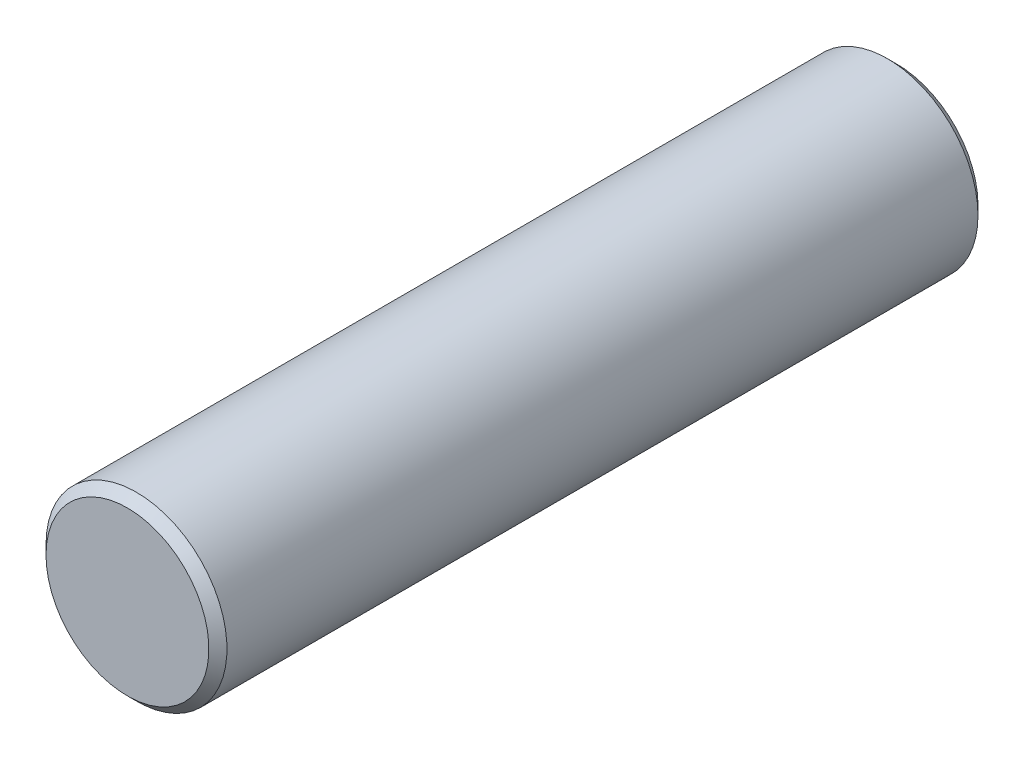
ISO-10303-21;
HEADER;
FILE_DESCRIPTION(('STEP AP214'),'2;1');
FILE_NAME('part.step','',(''),(''),'','','');
FILE_SCHEMA(('AUTOMOTIVE_DESIGN { 1 0 10303 214 1 1 1 1 }'));
ENDSEC;
DATA;
#1=APPLICATION_CONTEXT('core data for automotive mechanical design processes');
#2=APPLICATION_PROTOCOL_DEFINITION('international standard','automotive_design',2000,#1);
#3=PRODUCT_CONTEXT('',#1,'mechanical');
#4=PRODUCT('Part','Part','',(#3));
#5=PRODUCT_RELATED_PRODUCT_CATEGORY('part','',(#4));
#6=PRODUCT_DEFINITION_FORMATION('','',#4);
#7=PRODUCT_DEFINITION_CONTEXT('part definition',#1,'design');
#8=PRODUCT_DEFINITION('design','',#6,#7);
#9=PRODUCT_DEFINITION_SHAPE('','',#8);
#10=(LENGTH_UNIT() NAMED_UNIT(*) SI_UNIT(.MILLI.,.METRE.));
#11=(NAMED_UNIT(*) PLANE_ANGLE_UNIT() SI_UNIT($,.RADIAN.));
#12=(NAMED_UNIT(*) SI_UNIT($,.STERADIAN.) SOLID_ANGLE_UNIT());
#13=UNCERTAINTY_MEASURE_WITH_UNIT(LENGTH_MEASURE(1.E-05),#10,'distance_accuracy_value','');
#14=(GEOMETRIC_REPRESENTATION_CONTEXT(3) GLOBAL_UNCERTAINTY_ASSIGNED_CONTEXT((#13)) GLOBAL_UNIT_ASSIGNED_CONTEXT((#10,
#11,#12)) REPRESENTATION_CONTEXT('',''));
#15=CARTESIAN_POINT('',(0.,0.,0.));
#16=DIRECTION('',(0.,0.,1.));
#17=DIRECTION('',(1.,0.,0.));
#18=AXIS2_PLACEMENT_3D('',#15,#16,#17);
#19=CARTESIAN_POINT('',(9.99999999999999,0.,-85.));
#20=DIRECTION('',(0.,0.,1.));
#21=DIRECTION('',(1.,0.,0.));
#22=AXIS2_PLACEMENT_3D('',#19,#20,#21);
#23=PLANE('',#22);
#24=CARTESIAN_POINT('',(0.,0.,-85.));
#25=DIRECTION('',(0.,0.,-1.));
#26=DIRECTION('',(-1.,0.,0.));
#27=AXIS2_PLACEMENT_3D('',#24,#25,#26);
#28=CIRCLE('',#27,0.5);
#29=CARTESIAN_POINT('',(-0.500000000000005,0.,-85.));
#30=VERTEX_POINT('',#29);
#31=EDGE_CURVE('E52',#30,#30,#28,.T.);
#32=ORIENTED_EDGE('',*,*,#31,.F.);
#33=EDGE_LOOP('',(#32));
#34=FACE_BOUND('',#33,.T.);
#35=CARTESIAN_POINT('',(0.,0.,-85.));
#36=DIRECTION('',(0.,0.,1.));
#37=DIRECTION('',(1.,0.,0.));
#38=AXIS2_PLACEMENT_3D('',#35,#36,#37);
#39=CIRCLE('',#38,8.99999999999998);
#40=CARTESIAN_POINT('',(8.99999999999998,0.,-85.));
#41=VERTEX_POINT('',#40);
#42=EDGE_CURVE('E46',#41,#41,#39,.F.);
#43=ORIENTED_EDGE('',*,*,#42,.T.);
#44=EDGE_LOOP('',(#43));
#45=FACE_BOUND('',#44,.T.);
#46=ADVANCED_FACE('F31',(#34,#45),#23,.F.);
#47=CARTESIAN_POINT('',(0.,0.,-85.));
#48=DIRECTION('',(0.,0.,-1.));
#49=DIRECTION('',(-1.,0.,0.));
#50=AXIS2_PLACEMENT_3D('',#47,#48,#49);
#51=CYLINDRICAL_SURFACE('',#50,10.);
#52=CARTESIAN_POINT('',(0.,0.,-84.));
#53=DIRECTION('',(0.,0.,1.));
#54=DIRECTION('',(1.,0.,0.));
#55=AXIS2_PLACEMENT_3D('',#52,#53,#54);
#56=CIRCLE('',#55,10.);
#57=CARTESIAN_POINT('',(9.99999999999999,0.,-84.));
#58=VERTEX_POINT('',#57);
#59=EDGE_CURVE('E38',#58,#58,#56,.T.);
#60=ORIENTED_EDGE('',*,*,#59,.T.);
#61=EDGE_LOOP('',(#60));
#62=FACE_BOUND('',#61,.T.);
#63=CARTESIAN_POINT('',(0.,0.,-1.));
#64=DIRECTION('',(0.,0.,-1.));
#65=DIRECTION('',(-1.,0.,0.));
#66=AXIS2_PLACEMENT_3D('',#63,#64,#65);
#67=CIRCLE('',#66,10.);
#68=CARTESIAN_POINT('',(-10.,0.,-1.));
#69=VERTEX_POINT('',#68);
#70=EDGE_CURVE('E42',#69,#69,#67,.T.);
#71=ORIENTED_EDGE('',*,*,#70,.T.);
#72=EDGE_LOOP('',(#71));
#73=FACE_BOUND('',#72,.T.);
#74=ADVANCED_FACE('F68',(#62,#73),#51,.T.);
#75=CARTESIAN_POINT('',(10.,0.,0.));
#76=DIRECTION('',(0.,0.,-1.));
#77=DIRECTION('',(-1.,0.,0.));
#78=AXIS2_PLACEMENT_3D('',#75,#76,#77);
#79=PLANE('',#78);
#80=CARTESIAN_POINT('',(0.,0.,0.));
#81=DIRECTION('',(0.,0.,-1.));
#82=DIRECTION('',(-1.,0.,0.));
#83=AXIS2_PLACEMENT_3D('',#80,#81,#82);
#84=CIRCLE('',#83,9.);
#85=CARTESIAN_POINT('',(-9.,0.,0.));
#86=VERTEX_POINT('',#85);
#87=EDGE_CURVE('E10',#86,#86,#84,.F.);
#88=ORIENTED_EDGE('',*,*,#87,.T.);
#89=EDGE_LOOP('',(#88));
#90=FACE_BOUND('',#89,.T.);
#91=ADVANCED_FACE('F74',(#90),#79,.F.);
#92=CARTESIAN_POINT('',(0.,0.,-85.));
#93=DIRECTION('',(0.,0.,1.));
#94=DIRECTION('',(1.,0.,0.));
#95=AXIS2_PLACEMENT_3D('',#92,#93,#94);
#96=CONICAL_SURFACE('',#95,8.99999999999998,0.785398163397442);
#97=ORIENTED_EDGE('',*,*,#59,.F.);
#98=EDGE_LOOP('',(#97));
#99=FACE_BOUND('',#98,.T.);
#100=ORIENTED_EDGE('',*,*,#42,.F.);
#101=EDGE_LOOP('',(#100));
#102=FACE_BOUND('',#101,.T.);
#103=ADVANCED_FACE('F72',(#99,#102),#96,.T.);
#104=CARTESIAN_POINT('',(0.,0.,-1.));
#105=DIRECTION('',(0.,0.,-1.));
#106=DIRECTION('',(-1.,0.,0.));
#107=AXIS2_PLACEMENT_3D('',#104,#105,#106);
#108=CONICAL_SURFACE('',#107,10.,0.785398163397446);
#109=ORIENTED_EDGE('',*,*,#87,.F.);
#110=EDGE_LOOP('',(#109));
#111=FACE_BOUND('',#110,.T.);
#112=ORIENTED_EDGE('',*,*,#70,.F.);
#113=EDGE_LOOP('',(#112));
#114=FACE_BOUND('',#113,.T.);
#115=ADVANCED_FACE('F33',(#111,#114),#108,.T.);
#116=CARTESIAN_POINT('',(0.,0.,-82.));
#117=DIRECTION('',(0.,0.,-1.));
#118=DIRECTION('',(-1.,0.,0.));
#119=AXIS2_PLACEMENT_3D('',#116,#117,#118);
#120=CYLINDRICAL_SURFACE('',#119,0.5);
#121=CARTESIAN_POINT('',(0.,0.,-82.));
#122=DIRECTION('',(0.,0.,-1.));
#123=DIRECTION('',(-1.,0.,0.));
#124=AXIS2_PLACEMENT_3D('',#121,#122,#123);
#125=CIRCLE('',#124,0.5);
#126=CARTESIAN_POINT('',(-0.500000000000005,0.,-82.));
#127=VERTEX_POINT('',#126);
#128=EDGE_CURVE('E51',#127,#127,#125,.T.);
#129=ORIENTED_EDGE('',*,*,#128,.F.);
#130=EDGE_LOOP('',(#129));
#131=FACE_BOUND('',#130,.T.);
#132=ORIENTED_EDGE('',*,*,#31,.T.);
#133=EDGE_LOOP('',(#132));
#134=FACE_BOUND('',#133,.T.);
#135=ADVANCED_FACE('F60',(#131,#134),#120,.F.);
#136=CARTESIAN_POINT('',(0.,0.,-82.));
#137=DIRECTION('',(0.,0.,-1.));
#138=DIRECTION('',(-1.,0.,0.));
#139=AXIS2_PLACEMENT_3D('',#136,#137,#138);
#140=PLANE('',#139);
#141=ORIENTED_EDGE('',*,*,#128,.T.);
#142=EDGE_LOOP('',(#141));
#143=FACE_BOUND('',#142,.T.);
#144=ADVANCED_FACE('F58',(#143),#140,.T.);
#145=CLOSED_SHELL('',(#46,#74,#91,#103,#115,#135,#144));
#146=MANIFOLD_SOLID_BREP('B2',#145);
#147=ADVANCED_BREP_SHAPE_REPRESENTATION('',(#18,#146),#14);
#148=SHAPE_DEFINITION_REPRESENTATION(#9,#147);
ENDSEC;
END-ISO-10303-21;
